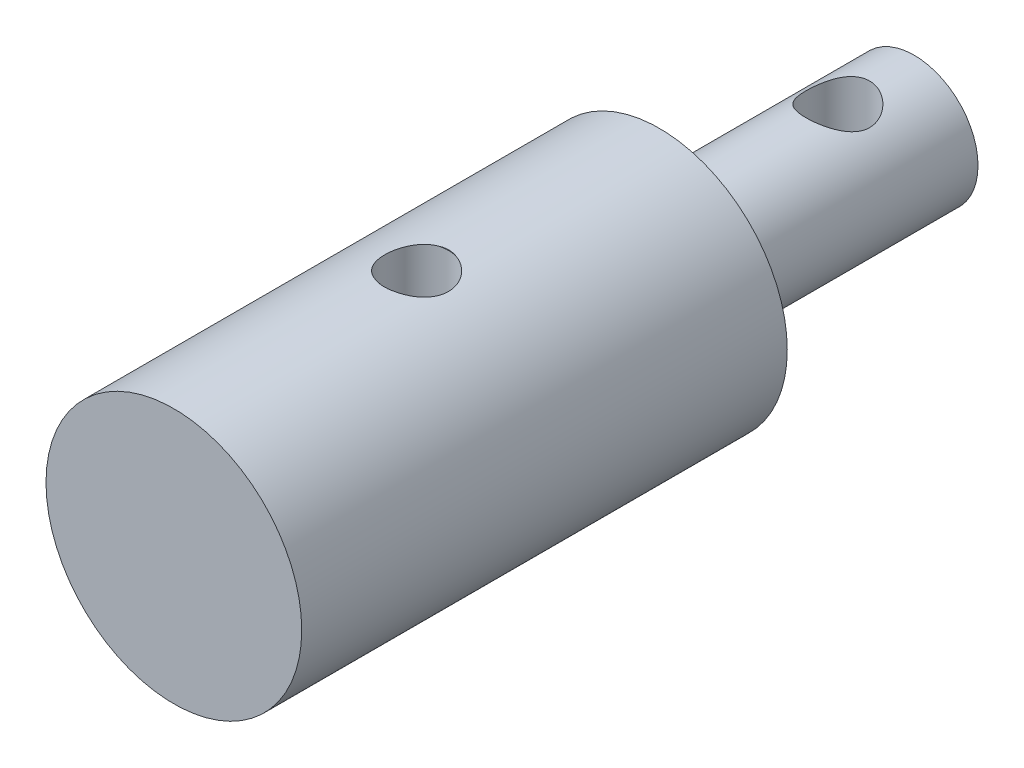
ISO-10303-21;
HEADER;
FILE_DESCRIPTION(('STEP AP214'),'2;1');
FILE_NAME('part.step','',(''),(''),'','','');
FILE_SCHEMA(('AUTOMOTIVE_DESIGN { 1 0 10303 214 1 1 1 1 }'));
ENDSEC;
DATA;
#1=APPLICATION_CONTEXT('core data for automotive mechanical design processes');
#2=APPLICATION_PROTOCOL_DEFINITION('international standard','automotive_design',2000,#1);
#3=PRODUCT_CONTEXT('',#1,'mechanical');
#4=PRODUCT('Part','Part','',(#3));
#5=PRODUCT_RELATED_PRODUCT_CATEGORY('part','',(#4));
#6=PRODUCT_DEFINITION_FORMATION('','',#4);
#7=PRODUCT_DEFINITION_CONTEXT('part definition',#1,'design');
#8=PRODUCT_DEFINITION('design','',#6,#7);
#9=PRODUCT_DEFINITION_SHAPE('','',#8);
#10=(LENGTH_UNIT() NAMED_UNIT(*) SI_UNIT(.MILLI.,.METRE.));
#11=(NAMED_UNIT(*) PLANE_ANGLE_UNIT() SI_UNIT($,.RADIAN.));
#12=(NAMED_UNIT(*) SI_UNIT($,.STERADIAN.) SOLID_ANGLE_UNIT());
#13=UNCERTAINTY_MEASURE_WITH_UNIT(LENGTH_MEASURE(1.E-05),#10,'distance_accuracy_value','');
#14=(GEOMETRIC_REPRESENTATION_CONTEXT(3) GLOBAL_UNCERTAINTY_ASSIGNED_CONTEXT((#13)) GLOBAL_UNIT_ASSIGNED_CONTEXT((#10,
#11,#12)) REPRESENTATION_CONTEXT('',''));
#15=CARTESIAN_POINT('',(0.,0.,0.));
#16=DIRECTION('',(0.,0.,1.));
#17=DIRECTION('',(1.,0.,0.));
#18=AXIS2_PLACEMENT_3D('',#15,#16,#17);
#19=CARTESIAN_POINT('',(0.,0.,20.));
#20=DIRECTION('',(0.,0.,-1.));
#21=DIRECTION('',(-1.,0.,0.));
#22=AXIS2_PLACEMENT_3D('',#19,#20,#21);
#23=CYLINDRICAL_SURFACE('',#22,5.);
#24=CARTESIAN_POINT('',(0.,-5.,8.5));
#25=CARTESIAN_POINT('',(0.131426682334305,-4.99999177550472,8.49999033094399));
#26=CARTESIAN_POINT('',(0.263015634437212,-4.99476199135277,8.48957443822597));
#27=CARTESIAN_POINT('',(0.522301454622882,-4.9743541856102,8.44836817883795));
#28=CARTESIAN_POINT('',(0.649990448564104,-4.9591572718767,8.41753911907498));
#29=CARTESIAN_POINT('',(0.897333631316203,-4.92040690922477,8.33701537728115));
#30=CARTESIAN_POINT('',(1.01701694536277,-4.89688595907259,8.28739401221727));
#31=CARTESIAN_POINT('',(1.24618160399671,-4.84364443325827,8.1710734737482));
#32=CARTESIAN_POINT('',(1.3556637520377,-4.81392434644421,8.1043756468549));
#33=CARTESIAN_POINT('',(1.56876952630998,-4.74890645050632,7.95120686835737));
#34=CARTESIAN_POINT('',(1.67163802294308,-4.71337997659091,7.86378379977022));
#35=CARTESIAN_POINT('',(1.86194861703332,-4.64149925776731,7.67369630401471));
#36=CARTESIAN_POINT('',(1.94937895911555,-4.60514440566897,7.57102037115989));
#37=CARTESIAN_POINT('',(2.11312999967247,-4.53247377945622,7.34379162555472));
#38=CARTESIAN_POINT('',(2.18806333849064,-4.49637967412567,7.21815975396499));
#39=CARTESIAN_POINT('',(2.31542056761491,-4.43214946943555,6.95408166020456));
#40=CARTESIAN_POINT('',(2.36786053751682,-4.40400769020792,6.81564467823738));
#41=CARTESIAN_POINT('',(2.44533110537653,-4.36144667591402,6.53833723640359));
#42=CARTESIAN_POINT('',(2.47181464267578,-4.34630678958452,6.39998886982042));
#43=CARTESIAN_POINT('',(2.50106748329741,-4.3295472487215,6.12005290556239));
#44=CARTESIAN_POINT('',(2.50386022093906,-4.3279142335843,5.97846864782491));
#45=CARTESIAN_POINT('',(2.48671821792512,-4.33777325642937,5.71428493920912));
#46=CARTESIAN_POINT('',(2.46946139884055,-4.34771909154984,5.59143992194171));
#47=CARTESIAN_POINT('',(2.41734962264384,-4.37690571834675,5.35069522656805));
#48=CARTESIAN_POINT('',(2.38248905974454,-4.39614947079454,5.23279713673689));
#49=CARTESIAN_POINT('',(2.29552445096459,-4.44218691031839,5.00192716858567));
#50=CARTESIAN_POINT('',(2.24303766778987,-4.46914601659993,4.88913400303548));
#51=CARTESIAN_POINT('',(2.12260421917012,-4.52758510703513,4.67341426852503));
#52=CARTESIAN_POINT('',(2.0546506095312,-4.55906711950477,4.57049216099979));
#53=CARTESIAN_POINT('',(1.89516513728193,-4.62782894758213,4.36369686814192));
#54=CARTESIAN_POINT('',(1.80173614592319,-4.66533775591865,4.2613578160596));
#55=CARTESIAN_POINT('',(1.59888894685344,-4.73869058251019,4.07316145352275));
#56=CARTESIAN_POINT('',(1.48946314143571,-4.77453379897003,3.98731201991529));
#57=CARTESIAN_POINT('',(1.25129126457962,-4.84254968207409,3.83078584742568));
#58=CARTESIAN_POINT('',(1.12188397899853,-4.87447460405015,3.76099881888564));
#59=CARTESIAN_POINT('',(0.851165538721984,-4.92894702803108,3.64475742739248));
#60=CARTESIAN_POINT('',(0.709863940663161,-4.95150197358893,3.5982845374621));
#61=CARTESIAN_POINT('',(0.431916229151779,-4.98310834353579,3.5338114907083));
#62=CARTESIAN_POINT('',(0.295853826370905,-4.9931234575324,3.513771910633));
#63=CARTESIAN_POINT('',(0.0219489998732872,-5.00182533647794,3.49633817216383));
#64=CARTESIAN_POINT('',(-0.11589254967511,-5.00051746803426,3.4989332859015));
#65=CARTESIAN_POINT('',(-0.378082429964656,-4.98727980633468,3.5255167210467));
#66=CARTESIAN_POINT('',(-0.502648520123706,-4.97618114219992,3.54783133182441));
#67=CARTESIAN_POINT('',(-0.746017230755971,-4.94555428287529,3.61059517973838));
#68=CARTESIAN_POINT('',(-0.864819214231883,-4.92602515837625,3.65104641613589));
#69=CARTESIAN_POINT('',(-1.09722152111965,-4.87960628532329,3.74999616608036));
#70=CARTESIAN_POINT('',(-1.21057599249831,-4.85252204417873,3.80897762528232));
#71=CARTESIAN_POINT('',(-1.42615340426439,-4.7935993579975,3.94276883912482));
#72=CARTESIAN_POINT('',(-1.52837157450203,-4.76175888940534,4.01758533651988));
#73=CARTESIAN_POINT('',(-1.72941922315487,-4.69270553315086,4.18940106329089));
#74=CARTESIAN_POINT('',(-1.82693019428496,-4.65527212009488,4.2878571709752));
#75=CARTESIAN_POINT('',(-2.0046408025722,-4.58155978921587,4.49981287804944));
#76=CARTESIAN_POINT('',(-2.08482846428685,-4.54528168472407,4.61332279706986));
#77=CARTESIAN_POINT('',(-2.22926978618995,-4.4762798054528,4.85910913548465));
#78=CARTESIAN_POINT('',(-2.29256373922243,-4.44381323981254,4.99202816529114));
#79=CARTESIAN_POINT('',(-2.39520706511459,-4.38935180726746,5.26877516888255));
#80=CARTESIAN_POINT('',(-2.43458729077055,-4.36734345549014,5.41258881599999));
#81=CARTESIAN_POINT('',(-2.48465421767005,-4.33903752569351,5.69227555736294));
#82=CARTESIAN_POINT('',(-2.4977324874436,-4.33143458674096,5.82758563411897));
#83=CARTESIAN_POINT('',(-2.50172288950898,-4.32913386592579,6.09861766738068));
#84=CARTESIAN_POINT('',(-2.49264462983266,-4.3344304902511,6.23433941987363));
#85=CARTESIAN_POINT('',(-2.45481530197331,-4.35594655164663,6.48870875561685));
#86=CARTESIAN_POINT('',(-2.42802074302696,-4.37107736338133,6.60775118172076));
#87=CARTESIAN_POINT('',(-2.35793843840543,-4.40927540337602,6.83952029219995));
#88=CARTESIAN_POINT('',(-2.31464538728732,-4.43234518434965,6.95224493156654));
#89=CARTESIAN_POINT('',(-2.20953919315538,-4.48571326433413,7.17656215271972));
#90=CARTESIAN_POINT('',(-2.14667719009403,-4.5163930799845,7.28756985173501));
#91=CARTESIAN_POINT('',(-2.0053780838799,-4.58088327077455,7.49818624324004));
#92=CARTESIAN_POINT('',(-1.92693287765888,-4.61469526970767,7.59778896262873));
#93=CARTESIAN_POINT('',(-1.74550556946065,-4.68655816327011,7.79535536374964));
#94=CARTESIAN_POINT('',(-1.6407002246921,-4.7246249151498,7.89164936417137));
#95=CARTESIAN_POINT('',(-1.41539785420684,-4.79694347383545,8.06565584942804));
#96=CARTESIAN_POINT('',(-1.29489242426332,-4.83119321905446,8.14335831860588));
#97=CARTESIAN_POINT('',(-1.03978808878536,-4.89245149457782,8.2780969794841));
#98=CARTESIAN_POINT('',(-0.905095560782286,-4.91940711437488,8.33498316778445));
#99=CARTESIAN_POINT('',(-0.69632870925735,-4.9517796092335,8.40218385879239));
#100=CARTESIAN_POINT('',(-0.625670413494087,-4.96122314081874,8.42155539800181));
#101=CARTESIAN_POINT('',(-0.482623997839256,-4.97717127275101,8.45406594837059));
#102=CARTESIAN_POINT('',(-0.4102369630924,-4.98367766823159,8.46720876667634));
#103=CARTESIAN_POINT('',(-0.28151868462167,-4.9923820076613,8.48473747228463));
#104=CARTESIAN_POINT('',(-0.225408499555444,-4.99523288466454,8.49045493653132));
#105=CARTESIAN_POINT('',(-0.112875528456288,-4.99904367329658,8.49808832946571));
#106=CARTESIAN_POINT('',(-0.0564527338382177,-5.00000353273198,8.50000415322547));
#107=CARTESIAN_POINT('',(0.,-5.,8.5));
#108=B_SPLINE_CURVE_WITH_KNOTS('',3,(#24,#25,#26,#27,#28,#29,#30,#31,#32,#33,#34,#35,#36,#37,
#38,#39,#40,#41,#42,#43,#44,#45,#46,#47,#48,#49,#50,#51,#52,#53,#54,#55,#56,#57,#58,#59,#60,#61,
#62,#63,#64,#65,#66,#67,#68,#69,#70,#71,#72,#73,#74,#75,#76,#77,#78,#79,#80,#81,#82,#83,#84,#85,
#86,#87,#88,#89,#90,#91,#92,#93,#94,#95,#96,#97,#98,#99,#100,#101,#102,#103,#104,#105,#106,
#107),.UNSPECIFIED.,.T.,.F.,(4,2,2,2,2,2,2,2,2,2,2,2,2,2,2,2,2,2,2,2,2,2,2,2,2,2,2,2,2,2,2,2,2,
2,2,2,2,2,2,2,2,4),(0.,0.394060643550731,0.788870374272993,1.18215538873075,1.57540940145392,
1.99245439679522,2.40981559413509,2.85954316076881,3.30894869745702,3.73145030350574,
4.15353393322551,4.52514281023301,4.89687009814196,5.27725600421218,5.65781303150554,
6.08662353334696,6.51563836496715,6.96457555536101,7.41315542280698,7.82458226178364,
8.2358141127869,8.61517266265304,8.99457304077328,9.38482140069746,9.77523626870848,
10.2039902661037,10.6330397153795,11.0828670540368,11.53211279863,11.9382326875698,
12.3441764966106,12.7114482562151,13.0788382197025,13.4709114195009,13.8631890285845,
14.303131068923,14.7433095845248,15.1866003415818,15.407934939208,15.6291340766843,
15.7983933645035,15.9676573239322),.UNSPECIFIED.);
#109=CARTESIAN_POINT('',(0.,-5.,8.5));
#110=VERTEX_POINT('',#109);
#111=EDGE_CURVE('E40',#110,#110,#108,.T.);
#112=ORIENTED_EDGE('',*,*,#111,.T.);
#113=EDGE_LOOP('',(#112));
#114=FACE_BOUND('',#113,.T.);
#115=CARTESIAN_POINT('',(0.,5.,8.5));
#116=CARTESIAN_POINT('',(-0.131426682334305,4.99999177550472,8.49999033094399));
#117=CARTESIAN_POINT('',(-0.263015634437212,4.99476199135277,8.48957443822597));
#118=CARTESIAN_POINT('',(-0.522301454622882,4.9743541856102,8.44836817883795));
#119=CARTESIAN_POINT('',(-0.649990448564104,4.9591572718767,8.41753911907498));
#120=CARTESIAN_POINT('',(-0.897333631316203,4.92040690922477,8.33701537728115));
#121=CARTESIAN_POINT('',(-1.01701694536277,4.89688595907259,8.28739401221727));
#122=CARTESIAN_POINT('',(-1.24618160399671,4.84364443325827,8.1710734737482));
#123=CARTESIAN_POINT('',(-1.3556637520377,4.81392434644421,8.1043756468549));
#124=CARTESIAN_POINT('',(-1.56876952630998,4.74890645050632,7.95120686835737));
#125=CARTESIAN_POINT('',(-1.67163802294308,4.71337997659091,7.86378379977022));
#126=CARTESIAN_POINT('',(-1.86194861703332,4.64149925776731,7.67369630401471));
#127=CARTESIAN_POINT('',(-1.94937895911555,4.60514440566897,7.57102037115989));
#128=CARTESIAN_POINT('',(-2.11312999967247,4.53247377945622,7.34379162555472));
#129=CARTESIAN_POINT('',(-2.18806333849064,4.49637967412567,7.21815975396499));
#130=CARTESIAN_POINT('',(-2.31542056761491,4.43214946943555,6.95408166020456));
#131=CARTESIAN_POINT('',(-2.36786053751682,4.40400769020792,6.81564467823738));
#132=CARTESIAN_POINT('',(-2.44533110537653,4.36144667591402,6.53833723640359));
#133=CARTESIAN_POINT('',(-2.47181464267578,4.34630678958452,6.39998886982042));
#134=CARTESIAN_POINT('',(-2.50106748329741,4.3295472487215,6.12005290556239));
#135=CARTESIAN_POINT('',(-2.50386022093906,4.3279142335843,5.97846864782491));
#136=CARTESIAN_POINT('',(-2.48671821792512,4.33777325642937,5.71428493920912));
#137=CARTESIAN_POINT('',(-2.46946139884055,4.34771909154984,5.59143992194171));
#138=CARTESIAN_POINT('',(-2.41734962264384,4.37690571834675,5.35069522656805));
#139=CARTESIAN_POINT('',(-2.38248905974454,4.39614947079454,5.23279713673689));
#140=CARTESIAN_POINT('',(-2.29552445096459,4.44218691031839,5.00192716858567));
#141=CARTESIAN_POINT('',(-2.24303766778987,4.46914601659993,4.88913400303548));
#142=CARTESIAN_POINT('',(-2.12260421917012,4.52758510703513,4.67341426852503));
#143=CARTESIAN_POINT('',(-2.0546506095312,4.55906711950477,4.57049216099979));
#144=CARTESIAN_POINT('',(-1.89516513728193,4.62782894758213,4.36369686814192));
#145=CARTESIAN_POINT('',(-1.80173614592319,4.66533775591865,4.2613578160596));
#146=CARTESIAN_POINT('',(-1.59888894685344,4.73869058251019,4.07316145352275));
#147=CARTESIAN_POINT('',(-1.48946314143571,4.77453379897003,3.98731201991529));
#148=CARTESIAN_POINT('',(-1.25129126457962,4.84254968207409,3.83078584742568));
#149=CARTESIAN_POINT('',(-1.12188397899853,4.87447460405015,3.76099881888564));
#150=CARTESIAN_POINT('',(-0.851165538721984,4.92894702803108,3.64475742739248));
#151=CARTESIAN_POINT('',(-0.709863940663161,4.95150197358893,3.5982845374621));
#152=CARTESIAN_POINT('',(-0.431916229151779,4.98310834353579,3.5338114907083));
#153=CARTESIAN_POINT('',(-0.295853826370905,4.9931234575324,3.513771910633));
#154=CARTESIAN_POINT('',(-0.0219489998732872,5.00182533647794,3.49633817216383));
#155=CARTESIAN_POINT('',(0.11589254967511,5.00051746803426,3.4989332859015));
#156=CARTESIAN_POINT('',(0.378082429964656,4.98727980633468,3.5255167210467));
#157=CARTESIAN_POINT('',(0.502648520123706,4.97618114219992,3.54783133182441));
#158=CARTESIAN_POINT('',(0.746017230755971,4.94555428287529,3.61059517973838));
#159=CARTESIAN_POINT('',(0.864819214231883,4.92602515837625,3.65104641613589));
#160=CARTESIAN_POINT('',(1.09722152111965,4.87960628532329,3.74999616608036));
#161=CARTESIAN_POINT('',(1.21057599249831,4.85252204417873,3.80897762528232));
#162=CARTESIAN_POINT('',(1.42615340426439,4.7935993579975,3.94276883912482));
#163=CARTESIAN_POINT('',(1.52837157450203,4.76175888940534,4.01758533651988));
#164=CARTESIAN_POINT('',(1.72941922315487,4.69270553315086,4.18940106329089));
#165=CARTESIAN_POINT('',(1.82693019428496,4.65527212009488,4.2878571709752));
#166=CARTESIAN_POINT('',(2.0046408025722,4.58155978921587,4.49981287804944));
#167=CARTESIAN_POINT('',(2.08482846428685,4.54528168472407,4.61332279706986));
#168=CARTESIAN_POINT('',(2.22926978618995,4.4762798054528,4.85910913548465));
#169=CARTESIAN_POINT('',(2.29256373922243,4.44381323981254,4.99202816529114));
#170=CARTESIAN_POINT('',(2.39520706511459,4.38935180726746,5.26877516888255));
#171=CARTESIAN_POINT('',(2.43458729077055,4.36734345549014,5.41258881599999));
#172=CARTESIAN_POINT('',(2.48465421767005,4.33903752569351,5.69227555736294));
#173=CARTESIAN_POINT('',(2.4977324874436,4.33143458674096,5.82758563411897));
#174=CARTESIAN_POINT('',(2.50172288950898,4.32913386592579,6.09861766738068));
#175=CARTESIAN_POINT('',(2.49264462983266,4.3344304902511,6.23433941987363));
#176=CARTESIAN_POINT('',(2.45481530197331,4.35594655164663,6.48870875561685));
#177=CARTESIAN_POINT('',(2.42802074302696,4.37107736338133,6.60775118172076));
#178=CARTESIAN_POINT('',(2.35793843840543,4.40927540337602,6.83952029219995));
#179=CARTESIAN_POINT('',(2.31464538728732,4.43234518434965,6.95224493156654));
#180=CARTESIAN_POINT('',(2.20953919315538,4.48571326433413,7.17656215271972));
#181=CARTESIAN_POINT('',(2.14667719009403,4.5163930799845,7.28756985173501));
#182=CARTESIAN_POINT('',(2.0053780838799,4.58088327077455,7.49818624324004));
#183=CARTESIAN_POINT('',(1.92693287765888,4.61469526970767,7.59778896262873));
#184=CARTESIAN_POINT('',(1.74550556946065,4.68655816327011,7.79535536374964));
#185=CARTESIAN_POINT('',(1.6407002246921,4.7246249151498,7.89164936417137));
#186=CARTESIAN_POINT('',(1.41539785420684,4.79694347383545,8.06565584942804));
#187=CARTESIAN_POINT('',(1.29489242426332,4.83119321905446,8.14335831860588));
#188=CARTESIAN_POINT('',(1.03978808878536,4.89245149457782,8.2780969794841));
#189=CARTESIAN_POINT('',(0.905095560782286,4.91940711437488,8.33498316778445));
#190=CARTESIAN_POINT('',(0.69632870925735,4.9517796092335,8.40218385879239));
#191=CARTESIAN_POINT('',(0.625670413494087,4.96122314081874,8.42155539800181));
#192=CARTESIAN_POINT('',(0.482623997839256,4.97717127275101,8.45406594837059));
#193=CARTESIAN_POINT('',(0.4102369630924,4.98367766823159,8.46720876667634));
#194=CARTESIAN_POINT('',(0.28151868462167,4.9923820076613,8.48473747228463));
#195=CARTESIAN_POINT('',(0.225408499555444,4.99523288466454,8.49045493653132));
#196=CARTESIAN_POINT('',(0.112875528456288,4.99904367329658,8.49808832946571));
#197=CARTESIAN_POINT('',(0.0564527338382177,5.00000353273198,8.50000415322547));
#198=CARTESIAN_POINT('',(0.,5.,8.5));
#199=B_SPLINE_CURVE_WITH_KNOTS('',3,(#115,#116,#117,#118,#119,#120,#121,#122,#123,#124,#125,
#126,#127,#128,#129,#130,#131,#132,#133,#134,#135,#136,#137,#138,#139,#140,#141,#142,#143,#144,
#145,#146,#147,#148,#149,#150,#151,#152,#153,#154,#155,#156,#157,#158,#159,#160,#161,#162,#163,
#164,#165,#166,#167,#168,#169,#170,#171,#172,#173,#174,#175,#176,#177,#178,#179,#180,#181,#182,
#183,#184,#185,#186,#187,#188,#189,#190,#191,#192,#193,#194,#195,#196,#197,#198),.UNSPECIFIED.,
.T.,.F.,(4,2,2,2,2,2,2,2,2,2,2,2,2,2,2,2,2,2,2,2,2,2,2,2,2,2,2,2,2,2,2,2,2,2,2,2,2,2,2,2,2,4),
(0.,0.394060643550731,0.788870374272993,1.18215538873075,1.57540940145392,1.99245439679522,
2.40981559413509,2.85954316076881,3.30894869745702,3.73145030350574,4.15353393322551,
4.52514281023301,4.89687009814196,5.27725600421218,5.65781303150554,6.08662353334696,
6.51563836496715,6.96457555536101,7.41315542280698,7.82458226178364,8.2358141127869,
8.61517266265304,8.99457304077328,9.38482140069746,9.77523626870848,10.2039902661037,
10.6330397153795,11.0828670540368,11.53211279863,11.9382326875698,12.3441764966106,
12.7114482562151,13.0788382197025,13.4709114195009,13.8631890285845,14.303131068923,
14.7433095845248,15.1866003415818,15.407934939208,15.6291340766843,15.7983933645035,
15.9676573239322),.UNSPECIFIED.);
#200=CARTESIAN_POINT('',(0.,5.,8.5));
#201=VERTEX_POINT('',#200);
#202=EDGE_CURVE('E115',#201,#201,#199,.T.);
#203=ORIENTED_EDGE('',*,*,#202,.T.);
#204=EDGE_LOOP('',(#203));
#205=FACE_BOUND('',#204,.T.);
#206=CARTESIAN_POINT('',(0.,0.,20.));
#207=DIRECTION('',(0.,0.,1.));
#208=DIRECTION('',(1.,0.,0.));
#209=AXIS2_PLACEMENT_3D('',#206,#207,#208);
#210=CIRCLE('',#209,5.);
#211=CARTESIAN_POINT('',(5.,0.,20.));
#212=VERTEX_POINT('',#211);
#213=EDGE_CURVE('E145',#212,#212,#210,.T.);
#214=ORIENTED_EDGE('',*,*,#213,.F.);
#215=EDGE_LOOP('',(#214));
#216=FACE_BOUND('',#215,.T.);
#217=CARTESIAN_POINT('',(0.,0.,0.));
#218=DIRECTION('',(0.,0.,1.));
#219=DIRECTION('',(1.,0.,0.));
#220=AXIS2_PLACEMENT_3D('',#217,#218,#219);
#221=CIRCLE('',#220,5.);
#222=CARTESIAN_POINT('',(5.,0.,0.));
#223=VERTEX_POINT('',#222);
#224=EDGE_CURVE('E148',#223,#223,#221,.T.);
#225=ORIENTED_EDGE('',*,*,#224,.T.);
#226=EDGE_LOOP('',(#225));
#227=FACE_BOUND('',#226,.T.);
#228=ADVANCED_FACE('F36',(#114,#205,#216,#227),#23,.T.);
#229=CARTESIAN_POINT('',(0.,0.,0.));
#230=DIRECTION('',(0.,0.,1.));
#231=DIRECTION('',(1.,0.,0.));
#232=AXIS2_PLACEMENT_3D('',#229,#230,#231);
#233=PLANE('',#232);
#234=ORIENTED_EDGE('',*,*,#224,.F.);
#235=EDGE_LOOP('',(#234));
#236=FACE_BOUND('',#235,.T.);
#237=ADVANCED_FACE('F132',(#236),#233,.F.);
#238=CARTESIAN_POINT('',(0.,0.,58.1));
#239=DIRECTION('',(0.,0.,-1.));
#240=DIRECTION('',(-1.,0.,0.));
#241=AXIS2_PLACEMENT_3D('',#238,#239,#240);
#242=CYLINDRICAL_SURFACE('',#241,10.033);
#243=CARTESIAN_POINT('',(0.,-10.033,41.55));
#244=CARTESIAN_POINT('',(0.138141572577407,-10.0329976545094,41.5499960968344));
#245=CARTESIAN_POINT('',(0.276326837597845,-10.0301185104062,41.5385116221642));
#246=CARTESIAN_POINT('',(0.548737956100676,-10.0189119930354,41.4929453742977));
#247=CARTESIAN_POINT('',(0.682961503515612,-10.0105815095172,41.4588507007493));
#248=CARTESIAN_POINT('',(0.943475906589123,-9.98939492425694,41.3692251635793));
#249=CARTESIAN_POINT('',(1.06977604484569,-9.97654423936348,41.3137199499274));
#250=CARTESIAN_POINT('',(1.3112722127671,-9.94768636553444,41.182938917372));
#251=CARTESIAN_POINT('',(1.4264678855791,-9.93167907520859,41.1076624633898));
#252=CARTESIAN_POINT('',(1.64484342712528,-9.89787985670867,40.9378480392632));
#253=CARTESIAN_POINT('',(1.7477636032022,-9.88006053997212,40.8429815475164));
#254=CARTESIAN_POINT('',(1.93640970528565,-9.84482787651199,40.6373833785963));
#255=CARTESIAN_POINT('',(2.02213370218002,-9.82741457552976,40.5266499238119));
#256=CARTESIAN_POINT('',(2.17517331105813,-9.79468958689296,40.2904474101891));
#257=CARTESIAN_POINT('',(2.24219881172685,-9.77941267868568,40.1647851269795));
#258=CARTESIAN_POINT('',(2.35407328729259,-9.75308943489564,39.9035346626898));
#259=CARTESIAN_POINT('',(2.3989257820604,-9.74204242789678,39.7679480609792));
#260=CARTESIAN_POINT('',(2.46429588996932,-9.72571119124352,39.493552279884));
#261=CARTESIAN_POINT('',(2.48528024036357,-9.72031660153676,39.3548610133386));
#262=CARTESIAN_POINT('',(2.50377213383248,-9.71557062815079,39.0758297933211));
#263=CARTESIAN_POINT('',(2.50128346967371,-9.71621826816873,38.9354901098598));
#264=CARTESIAN_POINT('',(2.47327245679787,-9.72338435378203,38.6607199253226));
#265=CARTESIAN_POINT('',(2.44830588653752,-9.72976113532411,38.5262284950368));
#266=CARTESIAN_POINT('',(2.37693419054452,-9.74744128789912,38.2634058311537));
#267=CARTESIAN_POINT('',(2.33052754646025,-9.75874500784671,38.1350750345533));
#268=CARTESIAN_POINT('',(2.21711837096808,-9.78513568627853,37.8867241743953));
#269=CARTESIAN_POINT('',(2.14991380083291,-9.80025947708717,37.7668004499409));
#270=CARTESIAN_POINT('',(1.99695778694411,-9.83256538422925,37.5397328799778));
#271=CARTESIAN_POINT('',(1.91120311735464,-9.84974785833265,37.4325912622934));
#272=CARTESIAN_POINT('',(1.72070053911427,-9.88483189310486,37.2309438933684));
#273=CARTESIAN_POINT('',(1.61548352222525,-9.90274003763228,37.1368819157065));
#274=CARTESIAN_POINT('',(1.39055459412498,-9.93681869852373,36.9676538005012));
#275=CARTESIAN_POINT('',(1.27084224602251,-9.95298916248607,36.8924882327084));
#276=CARTESIAN_POINT('',(1.01969021576343,-9.98185011661885,36.763025156219));
#277=CARTESIAN_POINT('',(0.88821210876116,-9.99452860906959,36.7087993420499));
#278=CARTESIAN_POINT('',(0.61762023669278,-10.0148897972884,36.6233427583465));
#279=CARTESIAN_POINT('',(0.478507927754165,-10.0225734421937,36.5921076198995));
#280=CARTESIAN_POINT('',(0.20039107616588,-10.0319388903308,36.5541958725496));
#281=CARTESIAN_POINT('',(0.0614737722514426,-10.033768365513,36.546914882165));
#282=CARTESIAN_POINT('',(-0.215594349639089,-10.0316397501569,36.5554609974931));
#283=CARTESIAN_POINT('',(-0.353745235020966,-10.0276821769516,36.5712860376427));
#284=CARTESIAN_POINT('',(-0.623261452989922,-10.0145187356375,36.6250967358276));
#285=CARTESIAN_POINT('',(-0.754696702061163,-10.005390915771,36.6627530313044));
#286=CARTESIAN_POINT('',(-1.00937811887172,-9.98291556657151,36.7587814053708));
#287=CARTESIAN_POINT('',(-1.13262346126458,-9.96956761272808,36.8171555680779));
#288=CARTESIAN_POINT('',(-1.36983383915134,-9.93977864367943,36.9541363978399));
#289=CARTESIAN_POINT('',(-1.48359664247534,-9.92328718623241,37.0330820384629));
#290=CARTESIAN_POINT('',(-1.69647437095711,-9.88912065228382,37.2085312064725));
#291=CARTESIAN_POINT('',(-1.79558678037928,-9.87144537325431,37.3050377430472));
#292=CARTESIAN_POINT('',(-1.97883810837841,-9.83637233128557,37.5156745528844));
#293=CARTESIAN_POINT('',(-2.06255320823736,-9.81899183170879,37.6301770357263));
#294=CARTESIAN_POINT('',(-2.20957960053153,-9.78695719592003,37.8719620625749));
#295=CARTESIAN_POINT('',(-2.27289179995248,-9.77230293852857,37.9992440381552));
#296=CARTESIAN_POINT('',(-2.37684456254704,-9.7475410063248,38.2622912382214));
#297=CARTESIAN_POINT('',(-2.41761946183703,-9.73740646277533,38.3980007134433));
#298=CARTESIAN_POINT('',(-2.47569555332586,-9.72280484530012,38.674639482778));
#299=CARTESIAN_POINT('',(-2.49300183892661,-9.71833654164189,38.815567637456));
#300=CARTESIAN_POINT('',(-2.50338463202527,-9.71566661074956,39.094331707158));
#301=CARTESIAN_POINT('',(-2.49713836623042,-9.71728982249015,39.2321411257272));
#302=CARTESIAN_POINT('',(-2.4621423080742,-9.72621529515383,39.5046753262604));
#303=CARTESIAN_POINT('',(-2.43339296221764,-9.73351744339578,39.6394001693739));
#304=CARTESIAN_POINT('',(-2.35457557903535,-9.75288072333367,39.9012100594707));
#305=CARTESIAN_POINT('',(-2.3046337726536,-9.76491364590317,40.0283353377193));
#306=CARTESIAN_POINT('',(-2.18494916999927,-9.79238680724161,40.2724929160986));
#307=CARTESIAN_POINT('',(-2.11520364530021,-9.80782751544758,40.3895238225943));
#308=CARTESIAN_POINT('',(-1.95576483898288,-9.84087664005639,40.6134449931145));
#309=CARTESIAN_POINT('',(-1.8656012889295,-9.85853087644014,40.71999370465));
#310=CARTESIAN_POINT('',(-1.668803312979,-9.89374342555165,40.916669144922));
#311=CARTESIAN_POINT('',(-1.5621649852495,-9.91130171453294,41.0067919723558));
#312=CARTESIAN_POINT('',(-1.33313313238369,-9.94472025528764,41.1696347762986));
#313=CARTESIAN_POINT('',(-1.21049105382423,-9.96054434912261,41.2420131490643));
#314=CARTESIAN_POINT('',(-0.954397296573104,-9.98833066982696,41.3650100887911));
#315=CARTESIAN_POINT('',(-0.820953483956685,-10.0002956758812,41.4156443238966));
#316=CARTESIAN_POINT('',(-0.573114081273029,-10.0172364791293,41.4861570231682));
#317=CARTESIAN_POINT('',(-0.459903983623008,-10.023107308497,41.5100465650884));
#318=CARTESIAN_POINT('',(-0.231139337134539,-10.0309899070205,41.5419690981707));
#319=CARTESIAN_POINT('',(-0.115584962888851,-10.0330019625044,41.5500032658326));
#320=CARTESIAN_POINT('',(0.,-10.033,41.55));
#321=B_SPLINE_CURVE_WITH_KNOTS('',3,(#243,#244,#245,#246,#247,#248,#249,#250,#251,#252,#253,
#254,#255,#256,#257,#258,#259,#260,#261,#262,#263,#264,#265,#266,#267,#268,#269,#270,#271,#272,
#273,#274,#275,#276,#277,#278,#279,#280,#281,#282,#283,#284,#285,#286,#287,#288,#289,#290,#291,
#292,#293,#294,#295,#296,#297,#298,#299,#300,#301,#302,#303,#304,#305,#306,#307,#308,#309,#310,
#311,#312,#313,#314,#315,#316,#317,#318,#319,#320),.UNSPECIFIED.,.T.,.F.,(4,2,2,2,2,2,2,2,2,2,2,
2,2,2,2,2,2,2,2,2,2,2,2,2,2,2,2,2,2,2,2,2,2,2,2,2,2,2,4),(0.,0.414001155116273,
0.828238723937638,1.24198156696291,1.65573770158881,2.0770967966286,2.49850313442671,
2.92612395393324,3.3536768686294,3.77271702177688,4.19168946763254,4.60057876990535,
5.00949703350205,5.42251946154799,5.83561377142814,6.26040682080872,6.6852126766973,
7.11146037303839,7.53762704870257,7.95295524144107,8.36824630819687,8.77742925862198,
9.18665338254946,9.60310154480764,10.019621135822,10.4462924069786,10.8729447083736,
11.2970256939104,11.7210146262556,12.1329064652129,12.5447901316436,12.9542541464291,
13.3637746018776,13.7839118549841,14.2041487649948,14.6319326896633,15.0594078472955,
15.4058340417329,15.7522345297051),.UNSPECIFIED.);
#322=CARTESIAN_POINT('',(0.,-10.033,41.55));
#323=VERTEX_POINT('',#322);
#324=EDGE_CURVE('E11',#323,#323,#321,.T.);
#325=ORIENTED_EDGE('',*,*,#324,.T.);
#326=EDGE_LOOP('',(#325));
#327=FACE_BOUND('',#326,.T.);
#328=CARTESIAN_POINT('',(0.707831194565491,10.008,36.6522979751437));
#329=CARTESIAN_POINT('',(0.775438219021337,10.0032217602326,36.672256469231));
#330=CARTESIAN_POINT('',(0.842123484888574,9.99781286609805,36.6950530603545));
#331=CARTESIAN_POINT('',(0.973238713746672,9.98590090520402,36.7461423626845));
#332=CARTESIAN_POINT('',(1.03766911757745,9.97939805378013,36.7744339924112));
#333=CARTESIAN_POINT('',(1.22673164385635,9.958525561851,36.8671632880444));
#334=CARTESIAN_POINT('',(1.34742591355888,9.94277024619986,36.9395417654412));
#335=CARTESIAN_POINT('',(1.57474082261862,9.90931522479879,37.1032496429759));
#336=CARTESIAN_POINT('',(1.68136394992856,9.89161586379699,37.1945756855842));
#337=CARTESIAN_POINT('',(1.87788841339836,9.85619613186687,37.3937690620046));
#338=CARTESIAN_POINT('',(1.96778782443735,9.83847575875577,37.5016382975527));
#339=CARTESIAN_POINT('',(2.12936064299182,9.80478598601947,37.7324626811745));
#340=CARTESIAN_POINT('',(2.20080557502567,9.7888398102724,37.8555813721404));
#341=CARTESIAN_POINT('',(2.32191774930928,9.76082335140324,38.1125242278285));
#342=CARTESIAN_POINT('',(2.37158651809786,9.74875279661072,38.2463476413571));
#343=CARTESIAN_POINT('',(2.44686651305745,9.73012977749532,38.5185433194812));
#344=CARTESIAN_POINT('',(2.47286795379296,9.72348800089202,38.656801366246));
#345=CARTESIAN_POINT('',(2.50132617728866,9.71620718040856,38.9358597431723));
#346=CARTESIAN_POINT('',(2.50378821631224,9.71556679643974,39.0766594987436));
#347=CARTESIAN_POINT('',(2.48533932075148,9.72030115640921,39.352915054247));
#348=CARTESIAN_POINT('',(2.46503466533887,9.72551987656562,39.4884145954292));
#349=CARTESIAN_POINT('',(2.402703037838,9.7411050417512,39.7540081168164));
#350=CARTESIAN_POINT('',(2.36067468395865,9.75147181423368,39.8841017525963));
#351=CARTESIAN_POINT('',(2.2558842236515,9.77624540381855,40.1361546343127));
#352=CARTESIAN_POINT('',(2.19299773860773,9.79067637620991,40.2580596760218));
#353=CARTESIAN_POINT('',(2.04834108976371,9.82195733099806,40.4897781108757));
#354=CARTESIAN_POINT('',(1.96656586165614,9.83880796167616,40.5995882495447));
#355=CARTESIAN_POINT('',(1.78367678044904,9.87362573714908,40.8073281265992));
#356=CARTESIAN_POINT('',(1.68207254770392,9.89161107336276,40.9048230652257));
#357=CARTESIAN_POINT('',(1.46384977722671,9.92624776100934,41.0814570017878));
#358=CARTESIAN_POINT('',(1.34724152491232,9.94290001371645,41.1606084712074));
#359=CARTESIAN_POINT('',(1.14312015943704,9.96800528448014,41.2753211478923));
#360=CARTESIAN_POINT('',(1.05888346177081,9.97734003587605,41.3166143698685));
#361=CARTESIAN_POINT('',(0.886249016383737,9.99416004687544,41.3895184576239));
#362=CARTESIAN_POINT('',(0.797855629211301,10.0016471953448,41.4211392198721));
#363=CARTESIAN_POINT('',(0.707831194565491,10.008,41.4477020248563));
#364=B_SPLINE_CURVE_WITH_KNOTS('',3,(#328,#329,#330,#331,#332,#333,#334,#335,#336,#337,#338,
#339,#340,#341,#342,#343,#344,#345,#346,#347,#348,#349,#350,#351,#352,#353,#354,#355,#356,#357,
#358,#359,#360,#361,#362,#363),.UNSPECIFIED.,.F.,.F.,(4,2,2,2,2,2,2,2,2,2,2,2,2,2,2,2,2,4),(0.,
0.211821568220165,0.423601489957297,0.846260662092797,1.26884500242625,1.69147795774417,
2.11911648593789,2.54672503129092,2.96714848560729,3.38747805869147,3.79687461099609,
4.20629720721445,4.61820648191364,5.03022632307461,5.45414769764036,5.87778000250318,
6.16004211234597,6.44201444951454),.UNSPECIFIED.);
#365=CARTESIAN_POINT('',(0.70783119456549,10.008,36.6522979751437));
#366=VERTEX_POINT('',#365);
#367=CARTESIAN_POINT('',(0.707831194565491,10.008,41.4477020248563));
#368=VERTEX_POINT('',#367);
#369=EDGE_CURVE('E75',#366,#368,#364,.T.);
#370=ORIENTED_EDGE('',*,*,#369,.T.);
#371=CARTESIAN_POINT('',(0.74502410028148,10.0053,41.4335784820307));
#372=CARTESIAN_POINT('',(0.687064478135267,10.0096176832789,41.4562167541684));
#373=CARTESIAN_POINT('',(0.628100075409656,10.0134989386542,41.4762873470869));
#374=CARTESIAN_POINT('',(0.508534878156805,10.020282955646,41.5110632774994));
#375=CARTESIAN_POINT('',(0.44793352651546,10.0231853794803,41.5257667630167));
#376=CARTESIAN_POINT('',(0.264497535771596,10.0302539774997,41.5614212990399));
#377=CARTESIAN_POINT('',(0.139836888387997,10.0327964425098,41.5739927474393));
#378=CARTESIAN_POINT('',(-0.0985766046679834,10.0331637934912,41.575809937119));
#379=CARTESIAN_POINT('',(-0.21232652655692,10.0313831433054,41.5670060712879));
#380=CARTESIAN_POINT('',(-0.436395901224285,10.0241277095225,41.530576257373));
#381=CARTESIAN_POINT('',(-0.546723860341997,10.0186630095823,41.5030016848142));
#382=CARTESIAN_POINT('',(-0.684529853301525,10.0096693900237,41.4564134749099));
#383=CARTESIAN_POINT('',(-0.714926088656976,10.0075435685474,41.4453413919513));
#384=CARTESIAN_POINT('',(-0.745024100281352,10.0053,41.4335784820307));
#385=B_SPLINE_CURVE_WITH_KNOTS('',3,(#371,#372,#373,#374,#375,#376,#377,#378,#379,#380,#381,
#382,#383,#384),.UNSPECIFIED.,.F.,.F.,(4,2,2,2,2,2,4),(0.,0.186995173991539,0.374054811768916,
0.747556364662642,1.08827673600637,1.42806828363708,1.52528555018451),.UNSPECIFIED.);
#386=CARTESIAN_POINT('',(-0.707831194565491,10.008,41.4477020248563));
#387=VERTEX_POINT('',#386);
#388=EDGE_CURVE('E49',#368,#387,#385,.T.);
#389=ORIENTED_EDGE('',*,*,#388,.T.);
#390=CARTESIAN_POINT('',(-0.707831194565491,10.008,41.4477020248563));
#391=CARTESIAN_POINT('',(-0.775438219021337,10.0032217602325,41.427743530769));
#392=CARTESIAN_POINT('',(-0.842123484888573,9.99781286609805,41.4049469396455));
#393=CARTESIAN_POINT('',(-0.973238713746671,9.98590090520402,41.3538576373155));
#394=CARTESIAN_POINT('',(-1.03766911757745,9.97939805378013,41.3255660075888));
#395=CARTESIAN_POINT('',(-1.22673164385635,9.958525561851,41.2328367119556));
#396=CARTESIAN_POINT('',(-1.34742591355888,9.94277024619986,41.1604582345587));
#397=CARTESIAN_POINT('',(-1.57474082261862,9.90931522479879,40.9967503570241));
#398=CARTESIAN_POINT('',(-1.68136394992856,9.89161586379699,40.9054243144158));
#399=CARTESIAN_POINT('',(-1.87788841339836,9.85619613186687,40.7062309379954));
#400=CARTESIAN_POINT('',(-1.96778782443735,9.83847575875577,40.5983617024472));
#401=CARTESIAN_POINT('',(-2.12936064299182,9.80478598601947,40.3675373188254));
#402=CARTESIAN_POINT('',(-2.20080557502566,9.7888398102724,40.2444186278596));
#403=CARTESIAN_POINT('',(-2.32191774930927,9.76082335140324,39.9874757721715));
#404=CARTESIAN_POINT('',(-2.37158651809786,9.74875279661072,39.8536523586429));
#405=CARTESIAN_POINT('',(-2.44686651305745,9.73012977749532,39.5814566805188));
#406=CARTESIAN_POINT('',(-2.47286795379296,9.72348800089202,39.443198633754));
#407=CARTESIAN_POINT('',(-2.50132617728866,9.71620718040856,39.1641402568277));
#408=CARTESIAN_POINT('',(-2.50378821631223,9.71556679643974,39.0233405012564));
#409=CARTESIAN_POINT('',(-2.48533932075147,9.72030115640921,38.747084945753));
#410=CARTESIAN_POINT('',(-2.46503466533887,9.72551987656562,38.6115854045708));
#411=CARTESIAN_POINT('',(-2.40270303783799,9.7411050417512,38.3459918831836));
#412=CARTESIAN_POINT('',(-2.36067468395865,9.75147181423368,38.2158982474037));
#413=CARTESIAN_POINT('',(-2.25588422365149,9.77624540381855,37.9638453656873));
#414=CARTESIAN_POINT('',(-2.19299773860772,9.79067637620991,37.8419403239782));
#415=CARTESIAN_POINT('',(-2.0483410897637,9.82195733099806,37.6102218891243));
#416=CARTESIAN_POINT('',(-1.96656586165614,9.83880796167616,37.5004117504553));
#417=CARTESIAN_POINT('',(-1.78367678044904,9.87362573714908,37.2926718734007));
#418=CARTESIAN_POINT('',(-1.68207254770392,9.89161107336276,37.1951769347743));
#419=CARTESIAN_POINT('',(-1.46384977722671,9.92624776100934,37.0185429982122));
#420=CARTESIAN_POINT('',(-1.34724152491232,9.94290001371645,36.9393915287926));
#421=CARTESIAN_POINT('',(-1.14312015943703,9.96800528448014,36.8246788521077));
#422=CARTESIAN_POINT('',(-1.05888346177081,9.97734003587605,36.7833856301314));
#423=CARTESIAN_POINT('',(-0.886249016383737,9.99416004687544,36.7104815423761));
#424=CARTESIAN_POINT('',(-0.797855629211302,10.0016471953448,36.6788607801279));
#425=CARTESIAN_POINT('',(-0.707831194565493,10.008,36.6522979751437));
#426=B_SPLINE_CURVE_WITH_KNOTS('',3,(#390,#391,#392,#393,#394,#395,#396,#397,#398,#399,#400,
#401,#402,#403,#404,#405,#406,#407,#408,#409,#410,#411,#412,#413,#414,#415,#416,#417,#418,#419,
#420,#421,#422,#423,#424,#425),.UNSPECIFIED.,.F.,.F.,(4,2,2,2,2,2,2,2,2,2,2,2,2,2,2,2,2,4),(0.,
0.211821568220162,0.423601489957293,0.846260662092793,1.26884500242625,1.69147795774416,
2.11911648593789,2.54672503129091,2.96714848560728,3.38747805869147,3.79687461099608,
4.20629720721445,4.61820648191363,5.0302263230746,5.45414769764036,5.87778000250317,
6.16004211234596,6.44201444951452),.UNSPECIFIED.);
#427=CARTESIAN_POINT('',(-0.707831194565491,10.008,36.6522979751437));
#428=VERTEX_POINT('',#427);
#429=EDGE_CURVE('E63',#387,#428,#426,.T.);
#430=ORIENTED_EDGE('',*,*,#429,.T.);
#431=CARTESIAN_POINT('',(-0.745024100281357,10.0053,36.6664215179693));
#432=CARTESIAN_POINT('',(-0.687064478135145,10.009617683279,36.6437832458315));
#433=CARTESIAN_POINT('',(-0.628100075409533,10.0134989386542,36.623712652913));
#434=CARTESIAN_POINT('',(-0.508534878156679,10.020282955646,36.5889367225005));
#435=CARTESIAN_POINT('',(-0.447933526515332,10.0231853794803,36.5742332369832));
#436=CARTESIAN_POINT('',(-0.264497535771464,10.0302539774997,36.5385787009601));
#437=CARTESIAN_POINT('',(-0.139836888387864,10.0327964425098,36.5260072525607));
#438=CARTESIAN_POINT('',(0.0985766046681157,10.0331637934912,36.524190062881));
#439=CARTESIAN_POINT('',(0.212326526557051,10.0313831433054,36.5329939287121));
#440=CARTESIAN_POINT('',(0.436395901224411,10.0241277095225,36.569423742627));
#441=CARTESIAN_POINT('',(0.54672386034212,10.0186630095823,36.5969983151858));
#442=CARTESIAN_POINT('',(0.684529853301656,10.0096693900237,36.6435865250901));
#443=CARTESIAN_POINT('',(0.714926088657119,10.0075435685474,36.6546586080487));
#444=CARTESIAN_POINT('',(0.745024100281506,10.0053,36.6664215179693));
#445=B_SPLINE_CURVE_WITH_KNOTS('',3,(#431,#432,#433,#434,#435,#436,#437,#438,#439,#440,#441,
#442,#443,#444),.UNSPECIFIED.,.F.,.F.,(4,2,2,2,2,2,4),(0.,0.186995173991542,0.37405481176892,
0.747556364662646,1.08827673600637,1.42806828363708,1.52528555018455),.UNSPECIFIED.);
#446=EDGE_CURVE('E83',#428,#366,#445,.T.);
#447=ORIENTED_EDGE('',*,*,#446,.T.);
#448=EDGE_LOOP('',(#370,#389,#430,#447));
#449=FACE_BOUND('',#448,.T.);
#450=CARTESIAN_POINT('',(0.,0.,58.1));
#451=DIRECTION('',(0.,0.,1.));
#452=DIRECTION('',(1.,0.,0.));
#453=AXIS2_PLACEMENT_3D('',#450,#451,#452);
#454=CIRCLE('',#453,10.033);
#455=CARTESIAN_POINT('',(10.033,0.,58.1));
#456=VERTEX_POINT('',#455);
#457=EDGE_CURVE('E149',#456,#456,#454,.T.);
#458=ORIENTED_EDGE('',*,*,#457,.F.);
#459=EDGE_LOOP('',(#458));
#460=FACE_BOUND('',#459,.T.);
#461=CARTESIAN_POINT('',(0.,0.,20.));
#462=DIRECTION('',(0.,0.,1.));
#463=DIRECTION('',(1.,0.,0.));
#464=AXIS2_PLACEMENT_3D('',#461,#462,#463);
#465=CIRCLE('',#464,10.033);
#466=CARTESIAN_POINT('',(10.033,0.,20.));
#467=VERTEX_POINT('',#466);
#468=EDGE_CURVE('E153',#467,#467,#465,.T.);
#469=ORIENTED_EDGE('',*,*,#468,.T.);
#470=EDGE_LOOP('',(#469));
#471=FACE_BOUND('',#470,.T.);
#472=ADVANCED_FACE('F81',(#327,#449,#460,#471),#242,.T.);
#473=CARTESIAN_POINT('',(0.,0.,58.1));
#474=DIRECTION('',(0.,0.,1.));
#475=DIRECTION('',(1.,0.,0.));
#476=AXIS2_PLACEMENT_3D('',#473,#474,#475);
#477=PLANE('',#476);
#478=ORIENTED_EDGE('',*,*,#457,.T.);
#479=EDGE_LOOP('',(#478));
#480=FACE_BOUND('',#479,.T.);
#481=ADVANCED_FACE('F109',(#480),#477,.T.);
#482=CARTESIAN_POINT('',(0.,0.,20.));
#483=DIRECTION('',(0.,0.,1.));
#484=DIRECTION('',(1.,0.,0.));
#485=AXIS2_PLACEMENT_3D('',#482,#483,#484);
#486=PLANE('',#485);
#487=ORIENTED_EDGE('',*,*,#213,.T.);
#488=EDGE_LOOP('',(#487));
#489=FACE_BOUND('',#488,.T.);
#490=ORIENTED_EDGE('',*,*,#468,.F.);
#491=EDGE_LOOP('',(#490));
#492=FACE_BOUND('',#491,.T.);
#493=ADVANCED_FACE('F107',(#489,#492),#486,.F.);
#494=CARTESIAN_POINT('',(0.,10.033,39.05));
#495=DIRECTION('',(0.,1.,0.));
#496=DIRECTION('',(0.,0.,1.));
#497=AXIS2_PLACEMENT_3D('',#494,#495,#496);
#498=CYLINDRICAL_SURFACE('',#497,2.5);
#499=CARTESIAN_POINT('',(0.,10.008,39.05));
#500=DIRECTION('',(0.,1.,0.));
#501=DIRECTION('',(0.,0.,1.));
#502=AXIS2_PLACEMENT_3D('',#499,#500,#501);
#503=CIRCLE('',#502,2.5);
#504=EDGE_CURVE('E56',#366,#428,#503,.T.);
#505=ORIENTED_EDGE('',*,*,#504,.T.);
#506=ORIENTED_EDGE('',*,*,#429,.F.);
#507=EDGE_CURVE('E72',#387,#368,#503,.T.);
#508=ORIENTED_EDGE('',*,*,#507,.T.);
#509=ORIENTED_EDGE('',*,*,#369,.F.);
#510=EDGE_LOOP('',(#505,#506,#508,#509));
#511=FACE_BOUND('',#510,.T.);
#512=ORIENTED_EDGE('',*,*,#324,.F.);
#513=EDGE_LOOP('',(#512));
#514=FACE_BOUND('',#513,.T.);
#515=ADVANCED_FACE('F77',(#511,#514),#498,.F.);
#516=CARTESIAN_POINT('',(0.,10.033,39.05));
#517=DIRECTION('',(0.,1.,0.));
#518=DIRECTION('',(0.,0.,1.));
#519=AXIS2_PLACEMENT_3D('',#516,#517,#518);
#520=CONICAL_SURFACE('',#519,2.525,0.785398163397422);
#521=ORIENTED_EDGE('',*,*,#507,.F.);
#522=ORIENTED_EDGE('',*,*,#388,.F.);
#523=EDGE_LOOP('',(#521,#522));
#524=FACE_BOUND('',#523,.T.);
#525=ADVANCED_FACE('F71',(#524),#520,.F.);
#526=ORIENTED_EDGE('',*,*,#504,.F.);
#527=ORIENTED_EDGE('',*,*,#446,.F.);
#528=EDGE_LOOP('',(#526,#527));
#529=FACE_BOUND('',#528,.T.);
#530=ADVANCED_FACE('F123',(#529),#520,.F.);
#531=CARTESIAN_POINT('',(0.,10.033,6.));
#532=DIRECTION('',(0.,1.,0.));
#533=DIRECTION('',(0.,0.,1.));
#534=AXIS2_PLACEMENT_3D('',#531,#532,#533);
#535=CYLINDRICAL_SURFACE('',#534,2.5);
#536=ORIENTED_EDGE('',*,*,#202,.F.);
#537=EDGE_LOOP('',(#536));
#538=FACE_BOUND('',#537,.T.);
#539=ORIENTED_EDGE('',*,*,#111,.F.);
#540=EDGE_LOOP('',(#539));
#541=FACE_BOUND('',#540,.T.);
#542=ADVANCED_FACE('F120',(#538,#541),#535,.F.);
#543=CLOSED_SHELL('',(#228,#237,#472,#481,#493,#515,#525,#530,#542));
#544=MANIFOLD_SOLID_BREP('B2',#543);
#545=ADVANCED_BREP_SHAPE_REPRESENTATION('',(#18,#544),#14);
#546=SHAPE_DEFINITION_REPRESENTATION(#9,#545);
ENDSEC;
END-ISO-10303-21;
